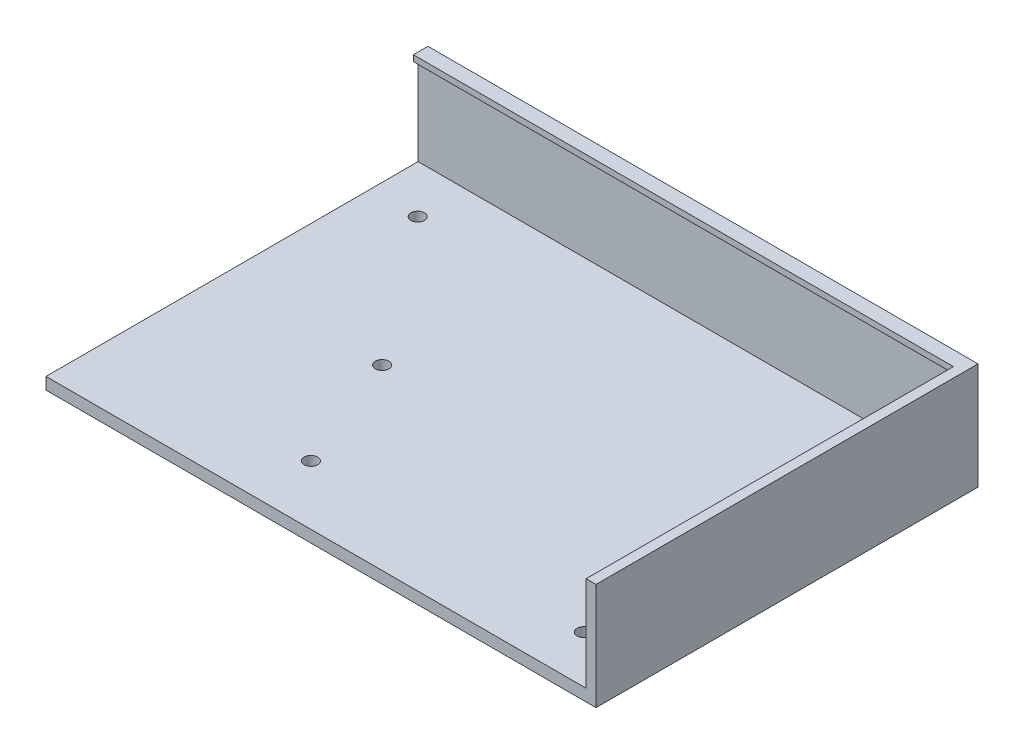
ISO-10303-21;
HEADER;
FILE_DESCRIPTION(('STEP AP214'),'2;1');
FILE_NAME('part.step','',(''),(''),'','','');
FILE_SCHEMA(('AUTOMOTIVE_DESIGN { 1 0 10303 214 1 1 1 1 }'));
ENDSEC;
DATA;
#1=APPLICATION_CONTEXT('core data for automotive mechanical design processes');
#2=APPLICATION_PROTOCOL_DEFINITION('international standard','automotive_design',2000,#1);
#3=PRODUCT_CONTEXT('',#1,'mechanical');
#4=PRODUCT('Part','Part','',(#3));
#5=PRODUCT_RELATED_PRODUCT_CATEGORY('part','',(#4));
#6=PRODUCT_DEFINITION_FORMATION('','',#4);
#7=PRODUCT_DEFINITION_CONTEXT('part definition',#1,'design');
#8=PRODUCT_DEFINITION('design','',#6,#7);
#9=PRODUCT_DEFINITION_SHAPE('','',#8);
#10=(LENGTH_UNIT() NAMED_UNIT(*) SI_UNIT(.MILLI.,.METRE.));
#11=(NAMED_UNIT(*) PLANE_ANGLE_UNIT() SI_UNIT($,.RADIAN.));
#12=(NAMED_UNIT(*) SI_UNIT($,.STERADIAN.) SOLID_ANGLE_UNIT());
#13=UNCERTAINTY_MEASURE_WITH_UNIT(LENGTH_MEASURE(1.E-05),#10,'distance_accuracy_value','');
#14=(GEOMETRIC_REPRESENTATION_CONTEXT(3) GLOBAL_UNCERTAINTY_ASSIGNED_CONTEXT((#13)) GLOBAL_UNIT_ASSIGNED_CONTEXT((#10,
#11,#12)) REPRESENTATION_CONTEXT('',''));
#15=CARTESIAN_POINT('',(0.,0.,0.));
#16=DIRECTION('',(0.,0.,1.));
#17=DIRECTION('',(1.,0.,0.));
#18=AXIS2_PLACEMENT_3D('',#15,#16,#17);
#19=CARTESIAN_POINT('',(139.1,27.,96.6));
#20=DIRECTION('',(-1.,0.,0.));
#21=DIRECTION('',(0.,0.,1.));
#22=AXIS2_PLACEMENT_3D('',#19,#20,#21);
#23=PLANE('',#22);
#24=DIRECTION('',(0.,0.,-1.));
#25=VECTOR('',#24,1.);
#26=CARTESIAN_POINT('',(139.1,27.,96.6));
#27=LINE('',#26,#25);
#28=CARTESIAN_POINT('',(139.1,27.,0.));
#29=VERTEX_POINT('',#28);
#30=CARTESIAN_POINT('',(139.1,27.,-96.6));
#31=VERTEX_POINT('',#30);
#32=EDGE_CURVE('E124',#29,#31,#27,.T.);
#33=ORIENTED_EDGE('',*,*,#32,.F.);
#34=DIRECTION('',(0.,-1.,0.));
#35=VECTOR('',#34,1.);
#36=CARTESIAN_POINT('',(139.1,27.,0.));
#37=LINE('',#36,#35);
#38=CARTESIAN_POINT('',(139.1,0.,0.));
#39=VERTEX_POINT('',#38);
#40=EDGE_CURVE('E110',#29,#39,#37,.T.);
#41=ORIENTED_EDGE('',*,*,#40,.T.);
#42=DIRECTION('',(0.,0.,-1.));
#43=VECTOR('',#42,1.);
#44=CARTESIAN_POINT('',(139.1,0.,96.6));
#45=LINE('',#44,#43);
#46=CARTESIAN_POINT('',(139.1,0.,-96.6));
#47=VERTEX_POINT('',#46);
#48=EDGE_CURVE('E136',#39,#47,#45,.T.);
#49=ORIENTED_EDGE('',*,*,#48,.T.);
#50=DIRECTION('',(0.,-1.,0.));
#51=VECTOR('',#50,1.);
#52=CARTESIAN_POINT('',(139.1,27.,-96.6));
#53=LINE('',#52,#51);
#54=EDGE_CURVE('E130',#31,#47,#53,.T.);
#55=ORIENTED_EDGE('',*,*,#54,.F.);
#56=EDGE_LOOP('',(#33,#41,#49,#55));
#57=FACE_BOUND('',#56,.T.);
#58=ADVANCED_FACE('F41',(#57),#23,.F.);
#59=CARTESIAN_POINT('',(-139.1,27.,-96.6));
#60=DIRECTION('',(0.,0.,1.));
#61=DIRECTION('',(1.,0.,0.));
#62=AXIS2_PLACEMENT_3D('',#59,#60,#61);
#63=PLANE('',#62);
#64=DIRECTION('',(-1.,0.,0.));
#65=VECTOR('',#64,1.);
#66=CARTESIAN_POINT('',(-139.1,0.,-96.6));
#67=LINE('',#66,#65);
#68=CARTESIAN_POINT('',(0.,0.,-96.6));
#69=VERTEX_POINT('',#68);
#70=EDGE_CURVE('E132',#47,#69,#67,.T.);
#71=ORIENTED_EDGE('',*,*,#70,.T.);
#72=DIRECTION('',(0.,1.,0.));
#73=VECTOR('',#72,1.);
#74=CARTESIAN_POINT('',(0.,27.,-96.6));
#75=LINE('',#74,#73);
#76=CARTESIAN_POINT('',(0.,27.,-96.6));
#77=VERTEX_POINT('',#76);
#78=EDGE_CURVE('E172',#69,#77,#75,.T.);
#79=ORIENTED_EDGE('',*,*,#78,.T.);
#80=DIRECTION('',(-1.,0.,0.));
#81=VECTOR('',#80,1.);
#82=CARTESIAN_POINT('',(-139.1,27.,-96.6));
#83=LINE('',#82,#81);
#84=EDGE_CURVE('E131',#31,#77,#83,.T.);
#85=ORIENTED_EDGE('',*,*,#84,.F.);
#86=ORIENTED_EDGE('',*,*,#54,.T.);
#87=EDGE_LOOP('',(#71,#79,#85,#86));
#88=FACE_BOUND('',#87,.T.);
#89=ADVANCED_FACE('F218',(#88),#63,.F.);
#90=CARTESIAN_POINT('',(0.,27.,0.));
#91=DIRECTION('',(0.,-1.,0.));
#92=DIRECTION('',(0.,0.,-1.));
#93=AXIS2_PLACEMENT_3D('',#90,#91,#92);
#94=PLANE('',#93);
#95=DIRECTION('',(0.,0.,-1.));
#96=VECTOR('',#95,1.);
#97=CARTESIAN_POINT('',(136.6,27.,92.9));
#98=LINE('',#97,#96);
#99=CARTESIAN_POINT('',(136.6,27.,0.));
#100=VERTEX_POINT('',#99);
#101=CARTESIAN_POINT('',(136.6,27.,-92.9));
#102=VERTEX_POINT('',#101);
#103=EDGE_CURVE('E62',#100,#102,#98,.T.);
#104=ORIENTED_EDGE('',*,*,#103,.F.);
#105=DIRECTION('',(-1.,0.,0.));
#106=VECTOR('',#105,1.);
#107=CARTESIAN_POINT('',(-200.,27.,0.));
#108=LINE('',#107,#106);
#109=EDGE_CURVE('E113',#29,#100,#108,.T.);
#110=ORIENTED_EDGE('',*,*,#109,.F.);
#111=ORIENTED_EDGE('',*,*,#32,.T.);
#112=ORIENTED_EDGE('',*,*,#84,.T.);
#113=DIRECTION('',(0.,0.,-1.));
#114=VECTOR('',#113,1.);
#115=CARTESIAN_POINT('',(0.,27.,200.));
#116=LINE('',#115,#114);
#117=CARTESIAN_POINT('',(0.,27.,-92.9));
#118=VERTEX_POINT('',#117);
#119=EDGE_CURVE('E119',#118,#77,#116,.T.);
#120=ORIENTED_EDGE('',*,*,#119,.F.);
#121=DIRECTION('',(-1.,0.,0.));
#122=VECTOR('',#121,1.);
#123=CARTESIAN_POINT('',(-136.6,27.,-92.9));
#124=LINE('',#123,#122);
#125=EDGE_CURVE('E210',#102,#118,#124,.T.);
#126=ORIENTED_EDGE('',*,*,#125,.F.);
#127=EDGE_LOOP('',(#104,#110,#111,#112,#120,#126));
#128=FACE_BOUND('',#127,.T.);
#129=ADVANCED_FACE('F122',(#128),#94,.F.);
#130=CARTESIAN_POINT('',(0.,0.,0.));
#131=DIRECTION('',(0.,-1.,0.));
#132=DIRECTION('',(0.,0.,-1.));
#133=AXIS2_PLACEMENT_3D('',#130,#131,#132);
#134=PLANE('',#133);
#135=DIRECTION('',(1.,0.,0.));
#136=VECTOR('',#135,1.);
#137=CARTESIAN_POINT('',(0.,0.,0.));
#138=LINE('',#137,#136);
#139=CARTESIAN_POINT('',(0.,0.,0.));
#140=VERTEX_POINT('',#139);
#141=EDGE_CURVE('E115',#140,#39,#138,.T.);
#142=ORIENTED_EDGE('',*,*,#141,.F.);
#143=DIRECTION('',(0.,0.,1.));
#144=VECTOR('',#143,1.);
#145=CARTESIAN_POINT('',(0.,0.,0.));
#146=LINE('',#145,#144);
#147=EDGE_CURVE('E170',#69,#140,#146,.T.);
#148=ORIENTED_EDGE('',*,*,#147,.F.);
#149=ORIENTED_EDGE('',*,*,#70,.F.);
#150=ORIENTED_EDGE('',*,*,#48,.F.);
#151=EDGE_LOOP('',(#142,#148,#149,#150));
#152=FACE_BOUND('',#151,.T.);
#153=CARTESIAN_POINT('',(52.,0.,-15.));
#154=DIRECTION('',(0.,-1.,0.));
#155=DIRECTION('',(0.,0.,-1.));
#156=AXIS2_PLACEMENT_3D('',#153,#154,#155);
#157=CIRCLE('',#156,1.7);
#158=CARTESIAN_POINT('',(52.,0.,-16.7));
#159=VERTEX_POINT('',#158);
#160=EDGE_CURVE('E196',#159,#159,#157,.T.);
#161=ORIENTED_EDGE('',*,*,#160,.F.);
#162=EDGE_LOOP('',(#161));
#163=FACE_BOUND('',#162,.T.);
#164=CARTESIAN_POINT('',(40.,0.,-45.));
#165=DIRECTION('',(0.,-1.,0.));
#166=DIRECTION('',(0.,0.,-1.));
#167=AXIS2_PLACEMENT_3D('',#164,#165,#166);
#168=CIRCLE('',#167,1.7);
#169=CARTESIAN_POINT('',(40.,0.,-46.7));
#170=VERTEX_POINT('',#169);
#171=EDGE_CURVE('E193',#170,#170,#168,.T.);
#172=ORIENTED_EDGE('',*,*,#171,.F.);
#173=EDGE_LOOP('',(#172));
#174=FACE_BOUND('',#173,.T.);
#175=CARTESIAN_POINT('',(124.,0.,-12.));
#176=DIRECTION('',(0.,-1.,0.));
#177=DIRECTION('',(0.,0.,-1.));
#178=AXIS2_PLACEMENT_3D('',#175,#176,#177);
#179=CIRCLE('',#178,1.70000000000001);
#180=CARTESIAN_POINT('',(124.,0.,-13.7));
#181=VERTEX_POINT('',#180);
#182=EDGE_CURVE('E190',#181,#181,#179,.T.);
#183=ORIENTED_EDGE('',*,*,#182,.F.);
#184=EDGE_LOOP('',(#183));
#185=FACE_BOUND('',#184,.T.);
#186=CARTESIAN_POINT('',(12.,0.,-82.));
#187=DIRECTION('',(0.,-1.,0.));
#188=DIRECTION('',(0.,0.,-1.));
#189=AXIS2_PLACEMENT_3D('',#186,#187,#188);
#190=CIRCLE('',#189,1.7);
#191=CARTESIAN_POINT('',(12.,0.,-83.7));
#192=VERTEX_POINT('',#191);
#193=EDGE_CURVE('E187',#192,#192,#190,.T.);
#194=ORIENTED_EDGE('',*,*,#193,.F.);
#195=EDGE_LOOP('',(#194));
#196=FACE_BOUND('',#195,.T.);
#197=ADVANCED_FACE('F221',(#152,#163,#174,#185,#196),#134,.T.);
#198=CARTESIAN_POINT('',(136.6,25.5,92.9));
#199=DIRECTION('',(1.,0.,0.));
#200=DIRECTION('',(0.,0.,-1.));
#201=AXIS2_PLACEMENT_3D('',#198,#199,#200);
#202=PLANE('',#201);
#203=DIRECTION('',(0.,0.,-1.));
#204=VECTOR('',#203,1.);
#205=CARTESIAN_POINT('',(136.6,3.,94.1));
#206=LINE('',#205,#204);
#207=CARTESIAN_POINT('',(136.6,3.,0.));
#208=VERTEX_POINT('',#207);
#209=CARTESIAN_POINT('',(136.6,3.,-94.1));
#210=VERTEX_POINT('',#209);
#211=EDGE_CURVE('E200',#208,#210,#206,.T.);
#212=ORIENTED_EDGE('',*,*,#211,.F.);
#213=DIRECTION('',(0.,1.,0.));
#214=VECTOR('',#213,1.);
#215=CARTESIAN_POINT('',(136.6,25.5,0.));
#216=LINE('',#215,#214);
#217=EDGE_CURVE('E223',#208,#100,#216,.T.);
#218=ORIENTED_EDGE('',*,*,#217,.T.);
#219=ORIENTED_EDGE('',*,*,#103,.T.);
#220=DIRECTION('',(0.,1.,0.));
#221=VECTOR('',#220,1.);
#222=CARTESIAN_POINT('',(136.6,25.5,-92.9));
#223=LINE('',#222,#221);
#224=CARTESIAN_POINT('',(136.6,25.5,-92.9));
#225=VERTEX_POINT('',#224);
#226=EDGE_CURVE('E139',#225,#102,#223,.T.);
#227=ORIENTED_EDGE('',*,*,#226,.F.);
#228=DIRECTION('',(0.,0.,-1.));
#229=VECTOR('',#228,1.);
#230=CARTESIAN_POINT('',(136.6,25.5,94.1));
#231=LINE('',#230,#229);
#232=CARTESIAN_POINT('',(136.6,25.5,-94.1));
#233=VERTEX_POINT('',#232);
#234=EDGE_CURVE('E199',#225,#233,#231,.T.);
#235=ORIENTED_EDGE('',*,*,#234,.T.);
#236=DIRECTION('',(0.,1.,0.));
#237=VECTOR('',#236,1.);
#238=CARTESIAN_POINT('',(136.6,3.,-94.1));
#239=LINE('',#238,#237);
#240=EDGE_CURVE('E203',#210,#233,#239,.T.);
#241=ORIENTED_EDGE('',*,*,#240,.F.);
#242=EDGE_LOOP('',(#212,#218,#219,#227,#235,#241));
#243=FACE_BOUND('',#242,.T.);
#244=ADVANCED_FACE('F227',(#243),#202,.F.);
#245=CARTESIAN_POINT('',(-136.6,25.5,-92.9));
#246=DIRECTION('',(0.,0.,-1.));
#247=DIRECTION('',(-1.,0.,0.));
#248=AXIS2_PLACEMENT_3D('',#245,#246,#247);
#249=PLANE('',#248);
#250=ORIENTED_EDGE('',*,*,#125,.T.);
#251=DIRECTION('',(0.,-1.,0.));
#252=VECTOR('',#251,1.);
#253=CARTESIAN_POINT('',(0.,25.5,-92.9));
#254=LINE('',#253,#252);
#255=CARTESIAN_POINT('',(0.,25.5,-92.9));
#256=VERTEX_POINT('',#255);
#257=EDGE_CURVE('E164',#118,#256,#254,.T.);
#258=ORIENTED_EDGE('',*,*,#257,.T.);
#259=DIRECTION('',(-1.,0.,0.));
#260=VECTOR('',#259,1.);
#261=CARTESIAN_POINT('',(-136.6,25.5,-92.9));
#262=LINE('',#261,#260);
#263=EDGE_CURVE('E207',#225,#256,#262,.T.);
#264=ORIENTED_EDGE('',*,*,#263,.F.);
#265=ORIENTED_EDGE('',*,*,#226,.T.);
#266=EDGE_LOOP('',(#250,#258,#264,#265));
#267=FACE_BOUND('',#266,.T.);
#268=ADVANCED_FACE('F213',(#267),#249,.F.);
#269=CARTESIAN_POINT('',(0.,25.5,0.));
#270=DIRECTION('',(0.,-1.,0.));
#271=DIRECTION('',(0.,0.,-1.));
#272=AXIS2_PLACEMENT_3D('',#269,#270,#271);
#273=PLANE('',#272);
#274=DIRECTION('',(0.,0.,1.));
#275=VECTOR('',#274,1.);
#276=CARTESIAN_POINT('',(0.,25.5,0.));
#277=LINE('',#276,#275);
#278=CARTESIAN_POINT('',(0.,25.5,-94.1));
#279=VERTEX_POINT('',#278);
#280=EDGE_CURVE('E162',#279,#256,#277,.T.);
#281=ORIENTED_EDGE('',*,*,#280,.F.);
#282=DIRECTION('',(-1.,0.,0.));
#283=VECTOR('',#282,1.);
#284=CARTESIAN_POINT('',(-136.6,25.5,-94.1));
#285=LINE('',#284,#283);
#286=EDGE_CURVE('E161',#233,#279,#285,.T.);
#287=ORIENTED_EDGE('',*,*,#286,.F.);
#288=ORIENTED_EDGE('',*,*,#234,.F.);
#289=ORIENTED_EDGE('',*,*,#263,.T.);
#290=EDGE_LOOP('',(#281,#287,#288,#289));
#291=FACE_BOUND('',#290,.T.);
#292=ADVANCED_FACE('F230',(#291),#273,.T.);
#293=CARTESIAN_POINT('',(-136.6,3.,-94.1));
#294=DIRECTION('',(0.,0.,-1.));
#295=DIRECTION('',(-1.,0.,0.));
#296=AXIS2_PLACEMENT_3D('',#293,#294,#295);
#297=PLANE('',#296);
#298=ORIENTED_EDGE('',*,*,#286,.T.);
#299=DIRECTION('',(0.,-1.,0.));
#300=VECTOR('',#299,1.);
#301=CARTESIAN_POINT('',(0.,3.,-94.1));
#302=LINE('',#301,#300);
#303=CARTESIAN_POINT('',(0.,3.,-94.1));
#304=VERTEX_POINT('',#303);
#305=EDGE_CURVE('E154',#279,#304,#302,.T.);
#306=ORIENTED_EDGE('',*,*,#305,.T.);
#307=DIRECTION('',(-1.,0.,0.));
#308=VECTOR('',#307,1.);
#309=CARTESIAN_POINT('',(-136.6,3.,-94.1));
#310=LINE('',#309,#308);
#311=EDGE_CURVE('E149',#210,#304,#310,.T.);
#312=ORIENTED_EDGE('',*,*,#311,.F.);
#313=ORIENTED_EDGE('',*,*,#240,.T.);
#314=EDGE_LOOP('',(#298,#306,#312,#313));
#315=FACE_BOUND('',#314,.T.);
#316=ADVANCED_FACE('F158',(#315),#297,.F.);
#317=CARTESIAN_POINT('',(0.,3.,0.));
#318=DIRECTION('',(0.,-1.,0.));
#319=DIRECTION('',(0.,0.,-1.));
#320=AXIS2_PLACEMENT_3D('',#317,#318,#319);
#321=PLANE('',#320);
#322=CARTESIAN_POINT('',(52.,3.,-15.));
#323=DIRECTION('',(0.,1.,0.));
#324=DIRECTION('',(0.,0.,1.));
#325=AXIS2_PLACEMENT_3D('',#322,#323,#324);
#326=CIRCLE('',#325,1.7);
#327=CARTESIAN_POINT('',(52.,3.,-13.3));
#328=VERTEX_POINT('',#327);
#329=EDGE_CURVE('E181',#328,#328,#326,.T.);
#330=ORIENTED_EDGE('',*,*,#329,.F.);
#331=EDGE_LOOP('',(#330));
#332=FACE_BOUND('',#331,.T.);
#333=CARTESIAN_POINT('',(40.,3.,-45.));
#334=DIRECTION('',(0.,1.,0.));
#335=DIRECTION('',(0.,0.,1.));
#336=AXIS2_PLACEMENT_3D('',#333,#334,#335);
#337=CIRCLE('',#336,1.7);
#338=CARTESIAN_POINT('',(40.,3.,-43.3));
#339=VERTEX_POINT('',#338);
#340=EDGE_CURVE('E184',#339,#339,#337,.T.);
#341=ORIENTED_EDGE('',*,*,#340,.F.);
#342=EDGE_LOOP('',(#341));
#343=FACE_BOUND('',#342,.T.);
#344=CARTESIAN_POINT('',(124.,3.,-12.));
#345=DIRECTION('',(0.,1.,0.));
#346=DIRECTION('',(0.,0.,1.));
#347=AXIS2_PLACEMENT_3D('',#344,#345,#346);
#348=CIRCLE('',#347,1.70000000000001);
#349=CARTESIAN_POINT('',(124.,3.,-10.3));
#350=VERTEX_POINT('',#349);
#351=EDGE_CURVE('E175',#350,#350,#348,.T.);
#352=ORIENTED_EDGE('',*,*,#351,.F.);
#353=EDGE_LOOP('',(#352));
#354=FACE_BOUND('',#353,.T.);
#355=CARTESIAN_POINT('',(12.,3.,-82.));
#356=DIRECTION('',(0.,1.,0.));
#357=DIRECTION('',(0.,0.,1.));
#358=AXIS2_PLACEMENT_3D('',#355,#356,#357);
#359=CIRCLE('',#358,1.7);
#360=CARTESIAN_POINT('',(12.,3.,-80.3));
#361=VERTEX_POINT('',#360);
#362=EDGE_CURVE('E178',#361,#361,#359,.T.);
#363=ORIENTED_EDGE('',*,*,#362,.F.);
#364=EDGE_LOOP('',(#363));
#365=FACE_BOUND('',#364,.T.);
#366=DIRECTION('',(0.,0.,1.));
#367=VECTOR('',#366,1.);
#368=CARTESIAN_POINT('',(0.,3.,0.));
#369=LINE('',#368,#367);
#370=CARTESIAN_POINT('',(0.,3.,0.));
#371=VERTEX_POINT('',#370);
#372=EDGE_CURVE('E48',#304,#371,#369,.T.);
#373=ORIENTED_EDGE('',*,*,#372,.T.);
#374=DIRECTION('',(1.,0.,0.));
#375=VECTOR('',#374,1.);
#376=CARTESIAN_POINT('',(0.,3.,0.));
#377=LINE('',#376,#375);
#378=EDGE_CURVE('E55',#371,#208,#377,.T.);
#379=ORIENTED_EDGE('',*,*,#378,.T.);
#380=ORIENTED_EDGE('',*,*,#211,.T.);
#381=ORIENTED_EDGE('',*,*,#311,.T.);
#382=EDGE_LOOP('',(#373,#379,#380,#381));
#383=FACE_BOUND('',#382,.T.);
#384=ADVANCED_FACE('F146',(#332,#343,#354,#365,#383),#321,.F.);
#385=CARTESIAN_POINT('',(12.,-1.,-82.));
#386=DIRECTION('',(0.,1.,0.));
#387=DIRECTION('',(0.,0.,1.));
#388=AXIS2_PLACEMENT_3D('',#385,#386,#387);
#389=CYLINDRICAL_SURFACE('',#388,1.7);
#390=ORIENTED_EDGE('',*,*,#193,.T.);
#391=EDGE_LOOP('',(#390));
#392=FACE_BOUND('',#391,.T.);
#393=ORIENTED_EDGE('',*,*,#362,.T.);
#394=EDGE_LOOP('',(#393));
#395=FACE_BOUND('',#394,.T.);
#396=ADVANCED_FACE('F265',(#392,#395),#389,.F.);
#397=CARTESIAN_POINT('',(124.,-1.,-12.));
#398=DIRECTION('',(0.,1.,0.));
#399=DIRECTION('',(0.,0.,1.));
#400=AXIS2_PLACEMENT_3D('',#397,#398,#399);
#401=CYLINDRICAL_SURFACE('',#400,1.70000000000001);
#402=ORIENTED_EDGE('',*,*,#182,.T.);
#403=EDGE_LOOP('',(#402));
#404=FACE_BOUND('',#403,.T.);
#405=ORIENTED_EDGE('',*,*,#351,.T.);
#406=EDGE_LOOP('',(#405));
#407=FACE_BOUND('',#406,.T.);
#408=ADVANCED_FACE('F301',(#404,#407),#401,.F.);
#409=CARTESIAN_POINT('',(40.,-1.,-45.));
#410=DIRECTION('',(0.,1.,0.));
#411=DIRECTION('',(0.,0.,1.));
#412=AXIS2_PLACEMENT_3D('',#409,#410,#411);
#413=CYLINDRICAL_SURFACE('',#412,1.7);
#414=ORIENTED_EDGE('',*,*,#171,.T.);
#415=EDGE_LOOP('',(#414));
#416=FACE_BOUND('',#415,.T.);
#417=ORIENTED_EDGE('',*,*,#340,.T.);
#418=EDGE_LOOP('',(#417));
#419=FACE_BOUND('',#418,.T.);
#420=ADVANCED_FACE('F292',(#416,#419),#413,.F.);
#421=CARTESIAN_POINT('',(52.,-1.,-15.));
#422=DIRECTION('',(0.,1.,0.));
#423=DIRECTION('',(0.,0.,1.));
#424=AXIS2_PLACEMENT_3D('',#421,#422,#423);
#425=CYLINDRICAL_SURFACE('',#424,1.7);
#426=ORIENTED_EDGE('',*,*,#160,.T.);
#427=EDGE_LOOP('',(#426));
#428=FACE_BOUND('',#427,.T.);
#429=ORIENTED_EDGE('',*,*,#329,.T.);
#430=EDGE_LOOP('',(#429));
#431=FACE_BOUND('',#430,.T.);
#432=ADVANCED_FACE('F275',(#428,#431),#425,.F.);
#433=CARTESIAN_POINT('',(0.,-1.2E-05,200.));
#434=DIRECTION('',(1.,0.,0.));
#435=DIRECTION('',(0.,0.,-1.));
#436=AXIS2_PLACEMENT_3D('',#433,#434,#435);
#437=PLANE('',#436);
#438=ORIENTED_EDGE('',*,*,#147,.T.);
#439=DIRECTION('',(0.,1.,0.));
#440=VECTOR('',#439,1.);
#441=CARTESIAN_POINT('',(0.,-1.2E-05,0.));
#442=LINE('',#441,#440);
#443=EDGE_CURVE('E11',#140,#371,#442,.T.);
#444=ORIENTED_EDGE('',*,*,#443,.T.);
#445=ORIENTED_EDGE('',*,*,#372,.F.);
#446=ORIENTED_EDGE('',*,*,#305,.F.);
#447=ORIENTED_EDGE('',*,*,#280,.T.);
#448=ORIENTED_EDGE('',*,*,#257,.F.);
#449=ORIENTED_EDGE('',*,*,#119,.T.);
#450=ORIENTED_EDGE('',*,*,#78,.F.);
#451=EDGE_LOOP('',(#438,#444,#445,#446,#447,#448,#449,#450));
#452=FACE_BOUND('',#451,.T.);
#453=ADVANCED_FACE('F153',(#452),#437,.F.);
#454=CARTESIAN_POINT('',(-200.,-1.2E-05,0.));
#455=DIRECTION('',(0.,0.,-1.));
#456=DIRECTION('',(-1.,0.,0.));
#457=AXIS2_PLACEMENT_3D('',#454,#455,#456);
#458=PLANE('',#457);
#459=ORIENTED_EDGE('',*,*,#109,.T.);
#460=ORIENTED_EDGE('',*,*,#217,.F.);
#461=ORIENTED_EDGE('',*,*,#378,.F.);
#462=ORIENTED_EDGE('',*,*,#443,.F.);
#463=ORIENTED_EDGE('',*,*,#141,.T.);
#464=ORIENTED_EDGE('',*,*,#40,.F.);
#465=EDGE_LOOP('',(#459,#460,#461,#462,#463,#464));
#466=FACE_BOUND('',#465,.T.);
#467=ADVANCED_FACE('F112',(#466),#458,.F.);
#468=CLOSED_SHELL('',(#58,#89,#129,#197,#244,#268,#292,#316,#384,#396,#408,#420,#432,#453,#467));
#469=MANIFOLD_SOLID_BREP('B2',#468);
#470=ADVANCED_BREP_SHAPE_REPRESENTATION('',(#18,#469),#14);
#471=SHAPE_DEFINITION_REPRESENTATION(#9,#470);
ENDSEC;
END-ISO-10303-21;
